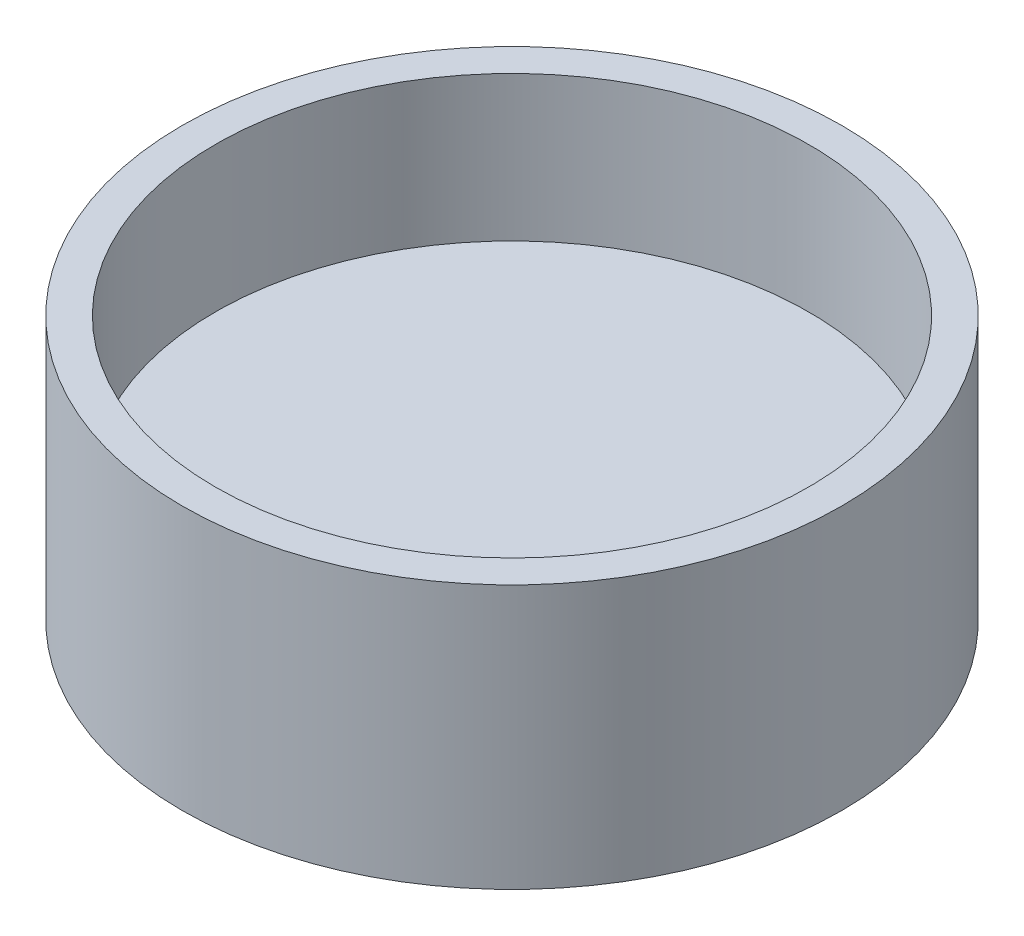
ISO-10303-21;
HEADER;
FILE_DESCRIPTION(('STEP AP214'),'2;1');
FILE_NAME('part.step','',(''),(''),'','','');
FILE_SCHEMA(('AUTOMOTIVE_DESIGN { 1 0 10303 214 1 1 1 1 }'));
ENDSEC;
DATA;
#1=APPLICATION_CONTEXT('core data for automotive mechanical design processes');
#2=APPLICATION_PROTOCOL_DEFINITION('international standard','automotive_design',2000,#1);
#3=PRODUCT_CONTEXT('',#1,'mechanical');
#4=PRODUCT('Part','Part','',(#3));
#5=PRODUCT_RELATED_PRODUCT_CATEGORY('part','',(#4));
#6=PRODUCT_DEFINITION_FORMATION('','',#4);
#7=PRODUCT_DEFINITION_CONTEXT('part definition',#1,'design');
#8=PRODUCT_DEFINITION('design','',#6,#7);
#9=PRODUCT_DEFINITION_SHAPE('','',#8);
#10=(LENGTH_UNIT() NAMED_UNIT(*) SI_UNIT(.MILLI.,.METRE.));
#11=(NAMED_UNIT(*) PLANE_ANGLE_UNIT() SI_UNIT($,.RADIAN.));
#12=(NAMED_UNIT(*) SI_UNIT($,.STERADIAN.) SOLID_ANGLE_UNIT());
#13=UNCERTAINTY_MEASURE_WITH_UNIT(LENGTH_MEASURE(1.E-05),#10,'distance_accuracy_value','');
#14=(GEOMETRIC_REPRESENTATION_CONTEXT(3) GLOBAL_UNCERTAINTY_ASSIGNED_CONTEXT((#13)) GLOBAL_UNIT_ASSIGNED_CONTEXT((#10,
#11,#12)) REPRESENTATION_CONTEXT('',''));
#15=CARTESIAN_POINT('',(0.,0.,0.));
#16=DIRECTION('',(0.,0.,1.));
#17=DIRECTION('',(1.,0.,0.));
#18=AXIS2_PLACEMENT_3D('',#15,#16,#17);
#19=CARTESIAN_POINT('',(0.,5.,0.));
#20=DIRECTION('',(0.,-1.,0.));
#21=DIRECTION('',(0.,0.,-1.));
#22=AXIS2_PLACEMENT_3D('',#19,#20,#21);
#23=CYLINDRICAL_SURFACE('',#22,12.5);
#24=CARTESIAN_POINT('',(0.,5.,0.));
#25=DIRECTION('',(0.,1.,0.));
#26=DIRECTION('',(0.,0.,1.));
#27=AXIS2_PLACEMENT_3D('',#24,#25,#26);
#28=CIRCLE('',#27,12.5);
#29=CARTESIAN_POINT('',(0.,5.,12.5));
#30=VERTEX_POINT('',#29);
#31=EDGE_CURVE('E10',#30,#30,#28,.T.);
#32=ORIENTED_EDGE('',*,*,#31,.F.);
#33=EDGE_LOOP('',(#32));
#34=FACE_BOUND('',#33,.T.);
#35=CARTESIAN_POINT('',(0.,-5.,0.));
#36=DIRECTION('',(0.,1.,0.));
#37=DIRECTION('',(0.,0.,1.));
#38=AXIS2_PLACEMENT_3D('',#35,#36,#37);
#39=CIRCLE('',#38,12.5);
#40=CARTESIAN_POINT('',(0.,-5.,12.5));
#41=VERTEX_POINT('',#40);
#42=EDGE_CURVE('E33',#41,#41,#39,.T.);
#43=ORIENTED_EDGE('',*,*,#42,.T.);
#44=EDGE_LOOP('',(#43));
#45=FACE_BOUND('',#44,.T.);
#46=ADVANCED_FACE('F30',(#34,#45),#23,.T.);
#47=CARTESIAN_POINT('',(0.,5.,0.));
#48=DIRECTION('',(0.,1.,0.));
#49=DIRECTION('',(0.,0.,1.));
#50=AXIS2_PLACEMENT_3D('',#47,#48,#49);
#51=PLANE('',#50);
#52=CARTESIAN_POINT('',(0.,5.,0.));
#53=DIRECTION('',(0.,1.,0.));
#54=DIRECTION('',(0.,0.,1.));
#55=AXIS2_PLACEMENT_3D('',#52,#53,#54);
#56=CIRCLE('',#55,11.25);
#57=CARTESIAN_POINT('',(0.,5.,11.25));
#58=VERTEX_POINT('',#57);
#59=EDGE_CURVE('E42',#58,#58,#56,.T.);
#60=ORIENTED_EDGE('',*,*,#59,.F.);
#61=EDGE_LOOP('',(#60));
#62=FACE_BOUND('',#61,.T.);
#63=ORIENTED_EDGE('',*,*,#31,.T.);
#64=EDGE_LOOP('',(#63));
#65=FACE_BOUND('',#64,.T.);
#66=ADVANCED_FACE('F67',(#62,#65),#51,.T.);
#67=CARTESIAN_POINT('',(0.,-5.,0.));
#68=DIRECTION('',(0.,1.,0.));
#69=DIRECTION('',(0.,0.,1.));
#70=AXIS2_PLACEMENT_3D('',#67,#68,#69);
#71=PLANE('',#70);
#72=CARTESIAN_POINT('',(0.,-5.,0.));
#73=DIRECTION('',(0.,-1.,0.));
#74=DIRECTION('',(0.,0.,-1.));
#75=AXIS2_PLACEMENT_3D('',#72,#73,#74);
#76=CIRCLE('',#75,11.25);
#77=CARTESIAN_POINT('',(0.,-5.,-11.25));
#78=VERTEX_POINT('',#77);
#79=EDGE_CURVE('E48',#78,#78,#76,.T.);
#80=ORIENTED_EDGE('',*,*,#79,.F.);
#81=EDGE_LOOP('',(#80));
#82=FACE_BOUND('',#81,.T.);
#83=ORIENTED_EDGE('',*,*,#42,.F.);
#84=EDGE_LOOP('',(#83));
#85=FACE_BOUND('',#84,.T.);
#86=ADVANCED_FACE('F63',(#82,#85),#71,.F.);
#87=CARTESIAN_POINT('',(0.,-0.5,0.));
#88=DIRECTION('',(0.,1.,0.));
#89=DIRECTION('',(0.,0.,1.));
#90=AXIS2_PLACEMENT_3D('',#87,#88,#89);
#91=CYLINDRICAL_SURFACE('',#90,11.25);
#92=CARTESIAN_POINT('',(0.,-0.5,0.));
#93=DIRECTION('',(0.,1.,0.));
#94=DIRECTION('',(0.,0.,1.));
#95=AXIS2_PLACEMENT_3D('',#92,#93,#94);
#96=CIRCLE('',#95,11.25);
#97=CARTESIAN_POINT('',(0.,-0.5,11.25));
#98=VERTEX_POINT('',#97);
#99=EDGE_CURVE('E40',#98,#98,#96,.T.);
#100=ORIENTED_EDGE('',*,*,#99,.F.);
#101=EDGE_LOOP('',(#100));
#102=FACE_BOUND('',#101,.T.);
#103=ORIENTED_EDGE('',*,*,#59,.T.);
#104=EDGE_LOOP('',(#103));
#105=FACE_BOUND('',#104,.T.);
#106=ADVANCED_FACE('F66',(#102,#105),#91,.F.);
#107=CARTESIAN_POINT('',(0.,-0.5,0.));
#108=DIRECTION('',(0.,1.,0.));
#109=DIRECTION('',(0.,0.,1.));
#110=AXIS2_PLACEMENT_3D('',#107,#108,#109);
#111=PLANE('',#110);
#112=ORIENTED_EDGE('',*,*,#99,.T.);
#113=EDGE_LOOP('',(#112));
#114=FACE_BOUND('',#113,.T.);
#115=ADVANCED_FACE('F59',(#114),#111,.T.);
#116=CARTESIAN_POINT('',(0.,-2.,0.));
#117=DIRECTION('',(0.,-1.,0.));
#118=DIRECTION('',(0.,0.,-1.));
#119=AXIS2_PLACEMENT_3D('',#116,#117,#118);
#120=CYLINDRICAL_SURFACE('',#119,11.25);
#121=CARTESIAN_POINT('',(0.,-2.,0.));
#122=DIRECTION('',(0.,-1.,0.));
#123=DIRECTION('',(0.,0.,-1.));
#124=AXIS2_PLACEMENT_3D('',#121,#122,#123);
#125=CIRCLE('',#124,11.25);
#126=CARTESIAN_POINT('',(0.,-2.,-11.25));
#127=VERTEX_POINT('',#126);
#128=EDGE_CURVE('E45',#127,#127,#125,.T.);
#129=ORIENTED_EDGE('',*,*,#128,.F.);
#130=EDGE_LOOP('',(#129));
#131=FACE_BOUND('',#130,.T.);
#132=ORIENTED_EDGE('',*,*,#79,.T.);
#133=EDGE_LOOP('',(#132));
#134=FACE_BOUND('',#133,.T.);
#135=ADVANCED_FACE('F56',(#131,#134),#120,.F.);
#136=CARTESIAN_POINT('',(0.,-2.,0.));
#137=DIRECTION('',(0.,-1.,0.));
#138=DIRECTION('',(0.,0.,-1.));
#139=AXIS2_PLACEMENT_3D('',#136,#137,#138);
#140=PLANE('',#139);
#141=ORIENTED_EDGE('',*,*,#128,.T.);
#142=EDGE_LOOP('',(#141));
#143=FACE_BOUND('',#142,.T.);
#144=ADVANCED_FACE('F54',(#143),#140,.T.);
#145=CLOSED_SHELL('',(#46,#66,#86,#106,#115,#135,#144));
#146=MANIFOLD_SOLID_BREP('B2',#145);
#147=ADVANCED_BREP_SHAPE_REPRESENTATION('',(#18,#146),#14);
#148=SHAPE_DEFINITION_REPRESENTATION(#9,#147);
ENDSEC;
END-ISO-10303-21;
